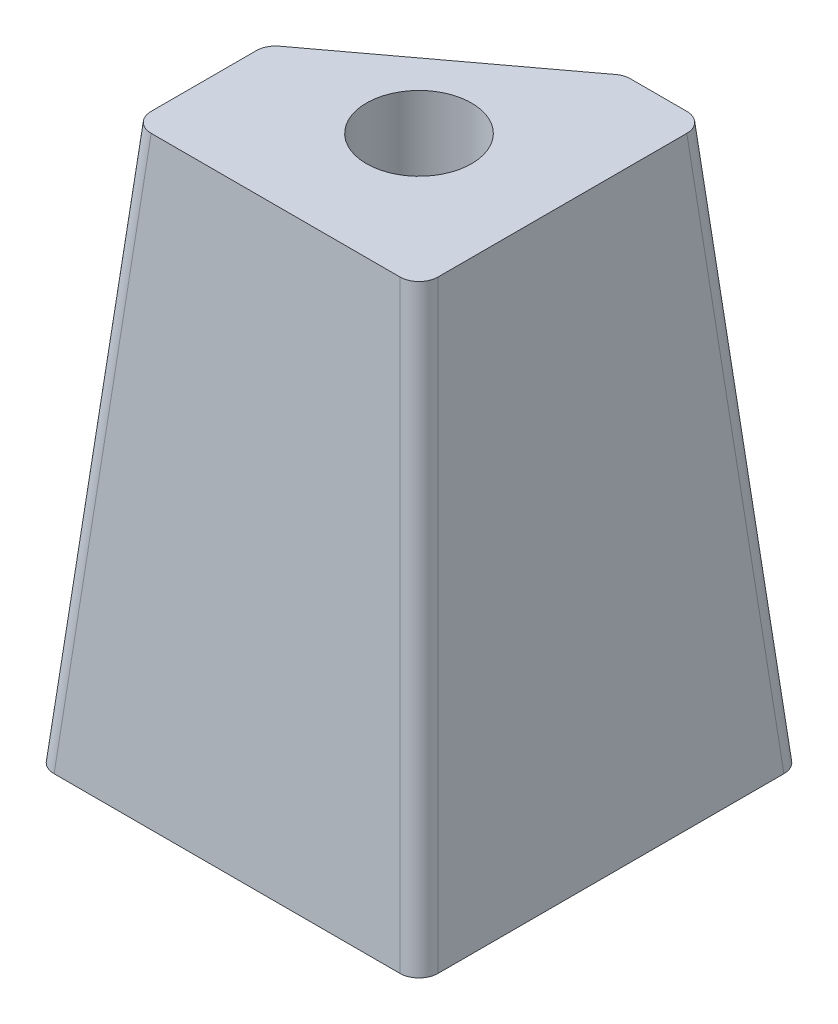
ISO-10303-21;
HEADER;
FILE_DESCRIPTION(('STEP AP214'),'2;1');
FILE_NAME('part.step','',(''),(''),'','','');
FILE_SCHEMA(('AUTOMOTIVE_DESIGN { 1 0 10303 214 1 1 1 1 }'));
ENDSEC;
DATA;
#1=APPLICATION_CONTEXT('core data for automotive mechanical design processes');
#2=APPLICATION_PROTOCOL_DEFINITION('international standard','automotive_design',2000,#1);
#3=PRODUCT_CONTEXT('',#1,'mechanical');
#4=PRODUCT('Part','Part','',(#3));
#5=PRODUCT_RELATED_PRODUCT_CATEGORY('part','',(#4));
#6=PRODUCT_DEFINITION_FORMATION('','',#4);
#7=PRODUCT_DEFINITION_CONTEXT('part definition',#1,'design');
#8=PRODUCT_DEFINITION('design','',#6,#7);
#9=PRODUCT_DEFINITION_SHAPE('','',#8);
#10=(LENGTH_UNIT() NAMED_UNIT(*) SI_UNIT(.MILLI.,.METRE.));
#11=(NAMED_UNIT(*) PLANE_ANGLE_UNIT() SI_UNIT($,.RADIAN.));
#12=(NAMED_UNIT(*) SI_UNIT($,.STERADIAN.) SOLID_ANGLE_UNIT());
#13=UNCERTAINTY_MEASURE_WITH_UNIT(LENGTH_MEASURE(1.E-05),#10,'distance_accuracy_value','');
#14=(GEOMETRIC_REPRESENTATION_CONTEXT(3) GLOBAL_UNCERTAINTY_ASSIGNED_CONTEXT((#13)) GLOBAL_UNIT_ASSIGNED_CONTEXT((#10,
#11,#12)) REPRESENTATION_CONTEXT('',''));
#15=CARTESIAN_POINT('',(0.,0.,0.));
#16=DIRECTION('',(0.,0.,1.));
#17=DIRECTION('',(1.,0.,0.));
#18=AXIS2_PLACEMENT_3D('',#15,#16,#17);
#19=CARTESIAN_POINT('',(-4.57964601769912,29.,7.20132743362832));
#20=DIRECTION('',(-0.996194698091746,0.0871557427476584,0.));
#21=DIRECTION('',(0.0871557427476584,0.996194698091746,0.));
#22=AXIS2_PLACEMENT_3D('',#19,#20,#21);
#23=PLANE('',#22);
#24=DIRECTION('',(0.,0.,1.));
#25=VECTOR('',#24,1.);
#26=CARTESIAN_POINT('',(-4.57964601769912,29.,7.20132743362832));
#27=LINE('',#26,#25);
#28=CARTESIAN_POINT('',(-4.57964601769912,29.,0.701272397167981));
#29=VERTEX_POINT('',#28);
#30=CARTESIAN_POINT('',(-4.57964601769912,29.,6.20513273553657));
#31=VERTEX_POINT('',#30);
#32=EDGE_CURVE('E144',#29,#31,#27,.T.);
#33=ORIENTED_EDGE('',*,*,#32,.F.);
#34=DIRECTION('',(0.0870724913818913,0.995243130626751,0.0436977366097345));
#35=VECTOR('',#34,1.);
#36=CARTESIAN_POINT('',(-4.55491414812916,29.2826865627297,0.713684201460962));
#37=LINE('',#36,#35);
#38=CARTESIAN_POINT('',(-7.11681725995092,0.,-0.572018844625635));
#39=VERTEX_POINT('',#38);
#40=EDGE_CURVE('E180',#29,#39,#37,.F.);
#41=ORIENTED_EDGE('',*,*,#40,.T.);
#42=DIRECTION('',(0.,0.,-1.));
#43=VECTOR('',#42,1.);
#44=CARTESIAN_POINT('',(-7.11681725995092,0.,0.));
#45=LINE('',#44,#43);
#46=CARTESIAN_POINT('',(-7.11681725995092,0.,8.74230397778837));
#47=VERTEX_POINT('',#46);
#48=EDGE_CURVE('E153',#39,#47,#45,.F.);
#49=ORIENTED_EDGE('',*,*,#48,.T.);
#50=DIRECTION('',(0.0868265938642478,0.992432509138967,-0.0868265938642478));
#51=VECTOR('',#50,1.);
#52=CARTESIAN_POINT('',(-4.58715618747273,28.914158366685,6.21264290531018));
#53=LINE('',#52,#51);
#54=EDGE_CURVE('E174',#47,#31,#53,.T.);
#55=ORIENTED_EDGE('',*,*,#54,.T.);
#56=EDGE_LOOP('',(#33,#41,#49,#55));
#57=FACE_BOUND('',#56,.T.);
#58=ADVANCED_FACE('F37',(#57),#23,.T.);
#59=CARTESIAN_POINT('',(10.4203539823009,29.,7.20132743362832));
#60=DIRECTION('',(0.,0.0871557427476584,0.996194698091746));
#61=DIRECTION('',(0.,0.996194698091746,-0.0871557427476584));
#62=AXIS2_PLACEMENT_3D('',#59,#60,#61);
#63=PLANE('',#62);
#64=DIRECTION('',(-1.,0.,0.));
#65=VECTOR('',#64,1.);
#66=CARTESIAN_POINT('',(0.,0.,9.73849867588012));
#67=LINE('',#66,#65);
#68=CARTESIAN_POINT('',(-6.12062256185918,0.,9.73849867588012));
#69=VERTEX_POINT('',#68);
#70=CARTESIAN_POINT('',(11.9613305264609,0.,9.73849867588012));
#71=VERTEX_POINT('',#70);
#72=EDGE_CURVE('E188',#69,#71,#67,.F.);
#73=ORIENTED_EDGE('',*,*,#72,.T.);
#74=DIRECTION('',(-0.0868265938642478,0.992432509138967,-0.0868265938642478));
#75=VECTOR('',#74,1.);
#76=CARTESIAN_POINT('',(9.43166945398275,28.914158366685,7.20883760340192));
#77=LINE('',#76,#75);
#78=CARTESIAN_POINT('',(9.42415928420914,29.,7.20132743362832));
#79=VERTEX_POINT('',#78);
#80=EDGE_CURVE('E11',#71,#79,#77,.T.);
#81=ORIENTED_EDGE('',*,*,#80,.T.);
#82=DIRECTION('',(1.,0.,0.));
#83=VECTOR('',#82,1.);
#84=CARTESIAN_POINT('',(10.4203539823009,29.,7.20132743362832));
#85=LINE('',#84,#83);
#86=CARTESIAN_POINT('',(-3.58345131960737,29.,7.20132743362832));
#87=VERTEX_POINT('',#86);
#88=EDGE_CURVE('E149',#87,#79,#85,.T.);
#89=ORIENTED_EDGE('',*,*,#88,.F.);
#90=DIRECTION('',(0.0868265938642478,0.992432509138967,-0.0868265938642478));
#91=VECTOR('',#90,1.);
#92=CARTESIAN_POINT('',(-3.47787862834998,30.2067013828153,7.09575474237092));
#93=LINE('',#92,#91);
#94=EDGE_CURVE('E48',#87,#69,#93,.F.);
#95=ORIENTED_EDGE('',*,*,#94,.T.);
#96=EDGE_LOOP('',(#73,#81,#89,#95));
#97=FACE_BOUND('',#96,.T.);
#98=ADVANCED_FACE('F186',(#97),#63,.T.);
#99=CARTESIAN_POINT('',(10.4203539823009,29.,-7.79867256637168));
#100=DIRECTION('',(0.996194698091746,0.0871557427476584,0.));
#101=DIRECTION('',(-0.0871557427476584,0.996194698091746,0.));
#102=AXIS2_PLACEMENT_3D('',#99,#100,#101);
#103=PLANE('',#102);
#104=DIRECTION('',(0.,0.,1.));
#105=VECTOR('',#104,1.);
#106=CARTESIAN_POINT('',(12.9575252245527,0.,0.));
#107=LINE('',#106,#105);
#108=CARTESIAN_POINT('',(12.9575252245527,0.,8.74230397778837));
#109=VERTEX_POINT('',#108);
#110=CARTESIAN_POINT('',(12.9575252245527,0.,-9.33964911053174));
#111=VERTEX_POINT('',#110);
#112=EDGE_CURVE('E148',#109,#111,#107,.F.);
#113=ORIENTED_EDGE('',*,*,#112,.T.);
#114=DIRECTION('',(-0.0868265938642478,0.992432509138967,0.0868265938642478));
#115=VECTOR('',#114,1.);
#116=CARTESIAN_POINT('',(10.4278641520745,28.914158366685,-6.80998803805355));
#117=LINE('',#116,#115);
#118=CARTESIAN_POINT('',(10.4203539823009,29.,-6.80247786827994));
#119=VERTEX_POINT('',#118);
#120=EDGE_CURVE('E54',#111,#119,#117,.T.);
#121=ORIENTED_EDGE('',*,*,#120,.T.);
#122=DIRECTION('',(0.,0.,-1.));
#123=VECTOR('',#122,1.);
#124=CARTESIAN_POINT('',(10.4203539823009,29.,-7.79867256637168));
#125=LINE('',#124,#123);
#126=CARTESIAN_POINT('',(10.4203539823009,29.,6.20513273553657));
#127=VERTEX_POINT('',#126);
#128=EDGE_CURVE('E203',#127,#119,#125,.T.);
#129=ORIENTED_EDGE('',*,*,#128,.F.);
#130=DIRECTION('',(-0.0868265938642478,0.992432509138967,-0.0868265938642478));
#131=VECTOR('',#130,1.);
#132=CARTESIAN_POINT('',(10.3147812910435,30.2067013828153,6.09956004427917));
#133=LINE('',#132,#131);
#134=EDGE_CURVE('E179',#127,#109,#133,.F.);
#135=ORIENTED_EDGE('',*,*,#134,.T.);
#136=EDGE_LOOP('',(#113,#121,#129,#135));
#137=FACE_BOUND('',#136,.T.);
#138=ADVANCED_FACE('F243',(#137),#103,.T.);
#139=CARTESIAN_POINT('',(6.15317736901956,29.,-7.79867256637168));
#140=DIRECTION('',(0.,0.0871557427476584,-0.996194698091746));
#141=DIRECTION('',(0.,0.996194698091746,0.0871557427476584));
#142=AXIS2_PLACEMENT_3D('',#139,#140,#141);
#143=PLANE('',#142);
#144=DIRECTION('',(1.,0.,0.));
#145=VECTOR('',#144,1.);
#146=CARTESIAN_POINT('',(0.,0.,-10.3358438086235));
#147=LINE('',#146,#145);
#148=CARTESIAN_POINT('',(11.9613305264609,0.,-10.3358438086235));
#149=VERTEX_POINT('',#148);
#150=CARTESIAN_POINT('',(5.64205583364326,0.,-10.3358438086235));
#151=VERTEX_POINT('',#150);
#152=EDGE_CURVE('E143',#149,#151,#147,.F.);
#153=ORIENTED_EDGE('',*,*,#152,.T.);
#154=DIRECTION('',(0.0288963352029625,0.995778700850393,0.087119347704982));
#155=VECTOR('',#154,1.);
#156=CARTESIAN_POINT('',(6.48332606858436,28.9904922451157,-7.79950438713965));
#157=LINE('',#156,#155);
#158=CARTESIAN_POINT('',(6.48360197252961,29.,-7.79867256637168));
#159=VERTEX_POINT('',#158);
#160=EDGE_CURVE('E124',#151,#159,#157,.T.);
#161=ORIENTED_EDGE('',*,*,#160,.T.);
#162=DIRECTION('',(-1.,0.,0.));
#163=VECTOR('',#162,1.);
#164=CARTESIAN_POINT('',(6.15317736901956,29.,-7.79867256637168));
#165=LINE('',#164,#163);
#166=CARTESIAN_POINT('',(9.42415928420914,29.,-7.79867256637168));
#167=VERTEX_POINT('',#166);
#168=EDGE_CURVE('E200',#167,#159,#165,.T.);
#169=ORIENTED_EDGE('',*,*,#168,.F.);
#170=DIRECTION('',(-0.0868265938642478,0.992432509138967,0.0868265938642478));
#171=VECTOR('',#170,1.);
#172=CARTESIAN_POINT('',(9.39949981798578,29.2818589886911,-7.77401310014833));
#173=LINE('',#172,#171);
#174=EDGE_CURVE('E129',#167,#149,#173,.F.);
#175=ORIENTED_EDGE('',*,*,#174,.T.);
#176=EDGE_LOOP('',(#153,#161,#169,#175));
#177=FACE_BOUND('',#176,.T.);
#178=ADVANCED_FACE('F239',(#177),#143,.T.);
#179=CARTESIAN_POINT('',(-4.57964601769912,29.,0.201327433628318));
#180=DIRECTION('',(-0.595351002863313,0.0871557427476584,-0.798724645854723));
#181=DIRECTION('',(0.0520864635693299,0.996194698091746,0.0698793517910468));
#182=AXIS2_PLACEMENT_3D('',#179,#180,#181);
#183=PLANE('',#182);
#184=DIRECTION('',(-0.801775644243755,0.,0.59762514697552));
#185=VECTOR('',#184,1.);
#186=CARTESIAN_POINT('',(-4.57964601769912,29.,0.201327433628318));
#187=LINE('',#186,#185);
#188=CARTESIAN_POINT('',(5.8882509696663,29.,-7.60120251413466));
#189=VERTEX_POINT('',#188);
#190=CARTESIAN_POINT('',(-4.17880232247069,29.,-0.0974522486867427));
#191=VERTEX_POINT('',#190);
#192=EDGE_CURVE('E138',#189,#191,#187,.T.);
#193=ORIENTED_EDGE('',*,*,#192,.F.);
#194=DIRECTION('',(0.0288963352029625,0.995778700850393,0.087119347704982));
#195=VECTOR('',#194,1.);
#196=CARTESIAN_POINT('',(5.89915261663084,29.3756749004757,-7.56833521917181));
#197=LINE('',#196,#195);
#198=CARTESIAN_POINT('',(5.04670483077995,0.,-10.1383737563865));
#199=VERTEX_POINT('',#198);
#200=EDGE_CURVE('E125',#189,#199,#197,.F.);
#201=ORIENTED_EDGE('',*,*,#200,.T.);
#202=DIRECTION('',(0.801775644243755,0.,-0.59762514697552));
#203=VECTOR('',#202,1.);
#204=CARTESIAN_POINT('',(-3.0554562361052,0.,-4.09920901849566));
#205=LINE('',#204,#203);
#206=CARTESIAN_POINT('',(-6.71597356472249,0.,-1.37074349048036));
#207=VERTEX_POINT('',#206);
#208=EDGE_CURVE('E135',#199,#207,#205,.F.);
#209=ORIENTED_EDGE('',*,*,#208,.T.);
#210=DIRECTION('',(0.0870724913818913,0.995243130626751,0.0436977366097345));
#211=VECTOR('',#210,1.);
#212=CARTESIAN_POINT('',(-4.18070454846125,28.9782574574362,-0.0984068896874585));
#213=LINE('',#212,#211);
#214=EDGE_CURVE('E136',#207,#191,#213,.T.);
#215=ORIENTED_EDGE('',*,*,#214,.T.);
#216=EDGE_LOOP('',(#193,#201,#209,#215));
#217=FACE_BOUND('',#216,.T.);
#218=ADVANCED_FACE('F133',(#217),#183,.T.);
#219=CARTESIAN_POINT('',(0.,29.,0.));
#220=DIRECTION('',(0.,-1.,0.));
#221=DIRECTION('',(0.,0.,-1.));
#222=AXIS2_PLACEMENT_3D('',#219,#220,#221);
#223=PLANE('',#222);
#224=CARTESIAN_POINT('',(3.42035398230088,29.,0.201327433628316));
#225=DIRECTION('',(0.,1.,0.));
#226=DIRECTION('',(0.,0.,1.));
#227=AXIS2_PLACEMENT_3D('',#224,#225,#226);
#228=CIRCLE('',#227,2.75);
#229=CARTESIAN_POINT('',(3.42035398230088,29.,2.95132743362832));
#230=VERTEX_POINT('',#229);
#231=EDGE_CURVE('E219',#230,#230,#228,.T.);
#232=ORIENTED_EDGE('',*,*,#231,.F.);
#233=EDGE_LOOP('',(#232));
#234=FACE_BOUND('',#233,.T.);
#235=ORIENTED_EDGE('',*,*,#168,.T.);
#236=CARTESIAN_POINT('',(6.48613113041896,29.,-6.79485272882834));
#237=DIRECTION('',(0.,-1.,0.));
#238=DIRECTION('',(-0.314820866332145,0.,-0.949151106053129));
#239=AXIS2_PLACEMENT_3D('',#236,#237,#238);
#240=ELLIPSE('',#239,1.00423919405587,1.);
#241=EDGE_CURVE('E173',#159,#189,#240,.F.);
#242=ORIENTED_EDGE('',*,*,#241,.T.);
#243=ORIENTED_EDGE('',*,*,#192,.T.);
#244=CARTESIAN_POINT('',(-3.57582618015577,29.,0.705099109027036));
#245=DIRECTION('',(0.,-1.,0.));
#246=DIRECTION('',(-0.893763152903363,0.,-0.448539214018396));
#247=AXIS2_PLACEMENT_3D('',#244,#245,#246);
#248=ELLIPSE('',#247,1.00477960533147,1.);
#249=EDGE_CURVE('E171',#191,#29,#248,.F.);
#250=ORIENTED_EDGE('',*,*,#249,.T.);
#251=ORIENTED_EDGE('',*,*,#32,.T.);
#252=CARTESIAN_POINT('',(-3.57582618015577,29.,6.19750759608497));
#253=DIRECTION('',(0.,-1.,0.));
#254=DIRECTION('',(-0.707106781186548,0.,0.707106781186548));
#255=AXIS2_PLACEMENT_3D('',#252,#253,#254);
#256=ELLIPSE('',#255,1.00762519445035,1.);
#257=EDGE_CURVE('E168',#31,#87,#256,.F.);
#258=ORIENTED_EDGE('',*,*,#257,.T.);
#259=ORIENTED_EDGE('',*,*,#88,.T.);
#260=CARTESIAN_POINT('',(9.41653414475753,29.,6.19750759608497));
#261=DIRECTION('',(0.,-1.,0.));
#262=DIRECTION('',(0.707106781186548,0.,0.707106781186548));
#263=AXIS2_PLACEMENT_3D('',#260,#261,#262);
#264=ELLIPSE('',#263,1.00762519445035,1.);
#265=EDGE_CURVE('E65',#79,#127,#264,.F.);
#266=ORIENTED_EDGE('',*,*,#265,.T.);
#267=ORIENTED_EDGE('',*,*,#128,.T.);
#268=CARTESIAN_POINT('',(9.41653414475753,29.,-6.79485272882834));
#269=DIRECTION('',(0.,-1.,0.));
#270=DIRECTION('',(0.707106781186548,0.,-0.707106781186548));
#271=AXIS2_PLACEMENT_3D('',#268,#269,#270);
#272=ELLIPSE('',#271,1.00762519445035,1.);
#273=EDGE_CURVE('E169',#119,#167,#272,.F.);
#274=ORIENTED_EDGE('',*,*,#273,.T.);
#275=EDGE_LOOP('',(#235,#242,#243,#250,#251,#258,#259,#266,#267,#274));
#276=FACE_BOUND('',#275,.T.);
#277=ADVANCED_FACE('F231',(#234,#276),#223,.F.);
#278=CARTESIAN_POINT('',(0.,0.,0.));
#279=DIRECTION('',(0.,-1.,0.));
#280=DIRECTION('',(0.,0.,-1.));
#281=AXIS2_PLACEMENT_3D('',#278,#279,#280);
#282=PLANE('',#281);
#283=CARTESIAN_POINT('',(-0.579646017699118,0.,2.20132743362832));
#284=DIRECTION('',(0.,-1.,0.));
#285=DIRECTION('',(0.,0.,-1.));
#286=AXIS2_PLACEMENT_3D('',#283,#284,#285);
#287=CIRCLE('',#286,1.5);
#288=CARTESIAN_POINT('',(-0.579646017699118,0.,0.701327433628316));
#289=VERTEX_POINT('',#288);
#290=EDGE_CURVE('E214',#289,#289,#287,.T.);
#291=ORIENTED_EDGE('',*,*,#290,.F.);
#292=EDGE_LOOP('',(#291));
#293=FACE_BOUND('',#292,.T.);
#294=CARTESIAN_POINT('',(7.42035398230088,0.,2.20132743362832));
#295=DIRECTION('',(0.,-1.,0.));
#296=DIRECTION('',(0.,0.,-1.));
#297=AXIS2_PLACEMENT_3D('',#294,#295,#296);
#298=CIRCLE('',#297,2.);
#299=CARTESIAN_POINT('',(7.42035398230088,0.,0.201327433628316));
#300=VERTEX_POINT('',#299);
#301=EDGE_CURVE('E209',#300,#300,#298,.T.);
#302=ORIENTED_EDGE('',*,*,#301,.F.);
#303=EDGE_LOOP('',(#302));
#304=FACE_BOUND('',#303,.T.);
#305=ORIENTED_EDGE('',*,*,#208,.F.);
#306=CARTESIAN_POINT('',(5.64458499153261,0.,-9.33202397108014));
#307=DIRECTION('',(0.,-1.,0.));
#308=DIRECTION('',(-0.314820866332145,0.,-0.949151106053129));
#309=AXIS2_PLACEMENT_3D('',#306,#307,#308);
#310=ELLIPSE('',#309,1.00423919405587,1.);
#311=EDGE_CURVE('E117',#199,#151,#310,.T.);
#312=ORIENTED_EDGE('',*,*,#311,.T.);
#313=ORIENTED_EDGE('',*,*,#152,.F.);
#314=CARTESIAN_POINT('',(11.9537053870093,0.,-9.33202397108014));
#315=DIRECTION('',(0.,-1.,0.));
#316=DIRECTION('',(0.707106781186548,0.,-0.707106781186548));
#317=AXIS2_PLACEMENT_3D('',#314,#315,#316);
#318=ELLIPSE('',#317,1.00762519445035,1.);
#319=EDGE_CURVE('E156',#149,#111,#318,.T.);
#320=ORIENTED_EDGE('',*,*,#319,.T.);
#321=ORIENTED_EDGE('',*,*,#112,.F.);
#322=CARTESIAN_POINT('',(11.9537053870093,0.,8.73467883833677));
#323=DIRECTION('',(0.,-1.,0.));
#324=DIRECTION('',(0.707106781186548,0.,0.707106781186548));
#325=AXIS2_PLACEMENT_3D('',#322,#323,#324);
#326=ELLIPSE('',#325,1.00762519445035,1.);
#327=EDGE_CURVE('E158',#109,#71,#326,.T.);
#328=ORIENTED_EDGE('',*,*,#327,.T.);
#329=ORIENTED_EDGE('',*,*,#72,.F.);
#330=CARTESIAN_POINT('',(-6.11299742240757,0.,8.73467883833677));
#331=DIRECTION('',(0.,-1.,0.));
#332=DIRECTION('',(-0.707106781186548,0.,0.707106781186548));
#333=AXIS2_PLACEMENT_3D('',#330,#331,#332);
#334=ELLIPSE('',#333,1.00762519445035,1.);
#335=EDGE_CURVE('E139',#69,#47,#334,.T.);
#336=ORIENTED_EDGE('',*,*,#335,.T.);
#337=ORIENTED_EDGE('',*,*,#48,.F.);
#338=CARTESIAN_POINT('',(-6.11299742240757,0.,-0.568192132766579));
#339=DIRECTION('',(0.,-1.,0.));
#340=DIRECTION('',(-0.893763152903363,0.,-0.448539214018396));
#341=AXIS2_PLACEMENT_3D('',#338,#339,#340);
#342=ELLIPSE('',#341,1.00477960533147,1.);
#343=EDGE_CURVE('E126',#39,#207,#342,.T.);
#344=ORIENTED_EDGE('',*,*,#343,.T.);
#345=EDGE_LOOP('',(#305,#312,#313,#320,#321,#328,#329,#336,#337,#344));
#346=FACE_BOUND('',#345,.T.);
#347=ADVANCED_FACE('F145',(#293,#304,#346),#282,.T.);
#348=CARTESIAN_POINT('',(7.42035398230088,10.,2.20132743362832));
#349=DIRECTION('',(0.,-1.,0.));
#350=DIRECTION('',(0.,0.,-1.));
#351=AXIS2_PLACEMENT_3D('',#348,#349,#350);
#352=CYLINDRICAL_SURFACE('',#351,2.);
#353=CARTESIAN_POINT('',(7.42035398230088,10.,2.20132743362832));
#354=DIRECTION('',(0.,-1.,0.));
#355=DIRECTION('',(0.,0.,-1.));
#356=AXIS2_PLACEMENT_3D('',#353,#354,#355);
#357=CIRCLE('',#356,2.);
#358=CARTESIAN_POINT('',(7.42035398230088,10.,0.201327433628316));
#359=VERTEX_POINT('',#358);
#360=EDGE_CURVE('E207',#359,#359,#357,.T.);
#361=ORIENTED_EDGE('',*,*,#360,.F.);
#362=EDGE_LOOP('',(#361));
#363=FACE_BOUND('',#362,.T.);
#364=ORIENTED_EDGE('',*,*,#301,.T.);
#365=EDGE_LOOP('',(#364));
#366=FACE_BOUND('',#365,.T.);
#367=ADVANCED_FACE('F281',(#363,#366),#352,.F.);
#368=CARTESIAN_POINT('',(7.42035398230088,10.,2.20132743362832));
#369=DIRECTION('',(0.,-1.,0.));
#370=DIRECTION('',(0.,0.,-1.));
#371=AXIS2_PLACEMENT_3D('',#368,#369,#370);
#372=PLANE('',#371);
#373=ORIENTED_EDGE('',*,*,#360,.T.);
#374=EDGE_LOOP('',(#373));
#375=FACE_BOUND('',#374,.T.);
#376=ADVANCED_FACE('F283',(#375),#372,.T.);
#377=CARTESIAN_POINT('',(-0.579646017699118,10.,2.20132743362832));
#378=DIRECTION('',(0.,-1.,0.));
#379=DIRECTION('',(0.,0.,-1.));
#380=AXIS2_PLACEMENT_3D('',#377,#378,#379);
#381=CYLINDRICAL_SURFACE('',#380,1.5);
#382=CARTESIAN_POINT('',(-0.579646017699118,10.,2.20132743362832));
#383=DIRECTION('',(0.,-1.,0.));
#384=DIRECTION('',(0.,0.,-1.));
#385=AXIS2_PLACEMENT_3D('',#382,#383,#384);
#386=CIRCLE('',#385,1.5);
#387=CARTESIAN_POINT('',(-0.579646017699118,10.,0.701327433628316));
#388=VERTEX_POINT('',#387);
#389=EDGE_CURVE('E197',#388,#388,#386,.T.);
#390=ORIENTED_EDGE('',*,*,#389,.F.);
#391=EDGE_LOOP('',(#390));
#392=FACE_BOUND('',#391,.T.);
#393=ORIENTED_EDGE('',*,*,#290,.T.);
#394=EDGE_LOOP('',(#393));
#395=FACE_BOUND('',#394,.T.);
#396=ADVANCED_FACE('F290',(#392,#395),#381,.F.);
#397=CARTESIAN_POINT('',(-0.579646017699118,10.,2.20132743362832));
#398=DIRECTION('',(0.,-1.,0.));
#399=DIRECTION('',(0.,0.,-1.));
#400=AXIS2_PLACEMENT_3D('',#397,#398,#399);
#401=PLANE('',#400);
#402=ORIENTED_EDGE('',*,*,#389,.T.);
#403=EDGE_LOOP('',(#402));
#404=FACE_BOUND('',#403,.T.);
#405=ADVANCED_FACE('F230',(#404),#401,.T.);
#406=CARTESIAN_POINT('',(3.42035398230088,23.,0.201327433628316));
#407=DIRECTION('',(0.,1.,0.));
#408=DIRECTION('',(0.,0.,1.));
#409=AXIS2_PLACEMENT_3D('',#406,#407,#408);
#410=CYLINDRICAL_SURFACE('',#409,2.75);
#411=CARTESIAN_POINT('',(3.42035398230088,23.,0.201327433628316));
#412=DIRECTION('',(0.,1.,0.));
#413=DIRECTION('',(0.,0.,1.));
#414=AXIS2_PLACEMENT_3D('',#411,#412,#413);
#415=CIRCLE('',#414,2.75);
#416=CARTESIAN_POINT('',(3.42035398230088,23.,2.95132743362832));
#417=VERTEX_POINT('',#416);
#418=EDGE_CURVE('E208',#417,#417,#415,.T.);
#419=ORIENTED_EDGE('',*,*,#418,.F.);
#420=EDGE_LOOP('',(#419));
#421=FACE_BOUND('',#420,.T.);
#422=ORIENTED_EDGE('',*,*,#231,.T.);
#423=EDGE_LOOP('',(#422));
#424=FACE_BOUND('',#423,.T.);
#425=ADVANCED_FACE('F228',(#421,#424),#410,.F.);
#426=CARTESIAN_POINT('',(3.42035398230088,23.,0.201327433628316));
#427=DIRECTION('',(0.,1.,0.));
#428=DIRECTION('',(0.,0.,1.));
#429=AXIS2_PLACEMENT_3D('',#426,#427,#428);
#430=PLANE('',#429);
#431=ORIENTED_EDGE('',*,*,#418,.T.);
#432=EDGE_LOOP('',(#431));
#433=FACE_BOUND('',#432,.T.);
#434=ADVANCED_FACE('F224',(#433),#430,.T.);
#435=CARTESIAN_POINT('',(6.49450361949416,29.288519157728,-6.76961057331709));
#436=DIRECTION('',(-0.0288963352029625,-0.995778700850393,-0.087119347704982));
#437=DIRECTION('',(0.,0.0871557427476583,-0.996194698091745));
#438=AXIS2_PLACEMENT_3D('',#435,#436,#437);
#439=CYLINDRICAL_SURFACE('',#438,1.);
#440=ORIENTED_EDGE('',*,*,#241,.F.);
#441=ORIENTED_EDGE('',*,*,#160,.F.);
#442=ORIENTED_EDGE('',*,*,#311,.F.);
#443=ORIENTED_EDGE('',*,*,#200,.F.);
#444=EDGE_LOOP('',(#440,#441,#442,#443));
#445=FACE_BOUND('',#444,.T.);
#446=ADVANCED_FACE('F122',(#445),#439,.T.);
#447=CARTESIAN_POINT('',(-3.55871945003742,29.195530819982,0.713684201460961));
#448=DIRECTION('',(-0.0870724913818913,-0.995243130626751,-0.0436977366097345));
#449=DIRECTION('',(0.996194698091745,-0.0871557427476583,0.));
#450=AXIS2_PLACEMENT_3D('',#447,#448,#449);
#451=CYLINDRICAL_SURFACE('',#450,1.);
#452=ORIENTED_EDGE('',*,*,#249,.F.);
#453=ORIENTED_EDGE('',*,*,#214,.F.);
#454=ORIENTED_EDGE('',*,*,#343,.F.);
#455=ORIENTED_EDGE('',*,*,#40,.F.);
#456=EDGE_LOOP('',(#452,#453,#454,#455));
#457=FACE_BOUND('',#456,.T.);
#458=ADVANCED_FACE('F254',(#457),#451,.T.);
#459=CARTESIAN_POINT('',(9.39949981798578,29.1947032459435,-6.77781840205658));
#460=DIRECTION('',(0.0868265938642478,-0.992432509138967,-0.0868265938642478));
#461=DIRECTION('',(0.,0.0871557427476584,-0.996194698091746));
#462=AXIS2_PLACEMENT_3D('',#459,#460,#461);
#463=CYLINDRICAL_SURFACE('',#462,1.);
#464=ORIENTED_EDGE('',*,*,#273,.F.);
#465=ORIENTED_EDGE('',*,*,#120,.F.);
#466=ORIENTED_EDGE('',*,*,#319,.F.);
#467=ORIENTED_EDGE('',*,*,#174,.F.);
#468=EDGE_LOOP('',(#464,#465,#466,#467));
#469=FACE_BOUND('',#468,.T.);
#470=ADVANCED_FACE('F245',(#469),#463,.T.);
#471=CARTESIAN_POINT('',(9.31858659295174,30.1195456400677,6.09956004427917));
#472=DIRECTION('',(0.0868265938642478,-0.992432509138967,0.0868265938642478));
#473=DIRECTION('',(0.,-0.0871557427476584,-0.996194698091746));
#474=AXIS2_PLACEMENT_3D('',#471,#472,#473);
#475=CYLINDRICAL_SURFACE('',#474,1.);
#476=ORIENTED_EDGE('',*,*,#265,.F.);
#477=ORIENTED_EDGE('',*,*,#80,.F.);
#478=ORIENTED_EDGE('',*,*,#327,.F.);
#479=ORIENTED_EDGE('',*,*,#134,.F.);
#480=EDGE_LOOP('',(#476,#477,#478,#479));
#481=FACE_BOUND('',#480,.T.);
#482=ADVANCED_FACE('F246',(#481),#475,.T.);
#483=CARTESIAN_POINT('',(-3.47787862834998,30.1195456400677,6.09956004427917));
#484=DIRECTION('',(-0.0868265938642478,-0.992432509138967,0.0868265938642478));
#485=DIRECTION('',(0.,-0.0871557427476584,-0.996194698091746));
#486=AXIS2_PLACEMENT_3D('',#483,#484,#485);
#487=CYLINDRICAL_SURFACE('',#486,1.);
#488=ORIENTED_EDGE('',*,*,#257,.F.);
#489=ORIENTED_EDGE('',*,*,#54,.F.);
#490=ORIENTED_EDGE('',*,*,#335,.F.);
#491=ORIENTED_EDGE('',*,*,#94,.F.);
#492=EDGE_LOOP('',(#488,#489,#490,#491));
#493=FACE_BOUND('',#492,.T.);
#494=ADVANCED_FACE('F45',(#493),#487,.T.);
#495=CLOSED_SHELL('',(#58,#98,#138,#178,#218,#277,#347,#367,#376,#396,#405,#425,#434,#446,#458,
#470,#482,#494));
#496=MANIFOLD_SOLID_BREP('B2',#495);
#497=ADVANCED_BREP_SHAPE_REPRESENTATION('',(#18,#496),#14);
#498=SHAPE_DEFINITION_REPRESENTATION(#9,#497);
ENDSEC;
END-ISO-10303-21;
